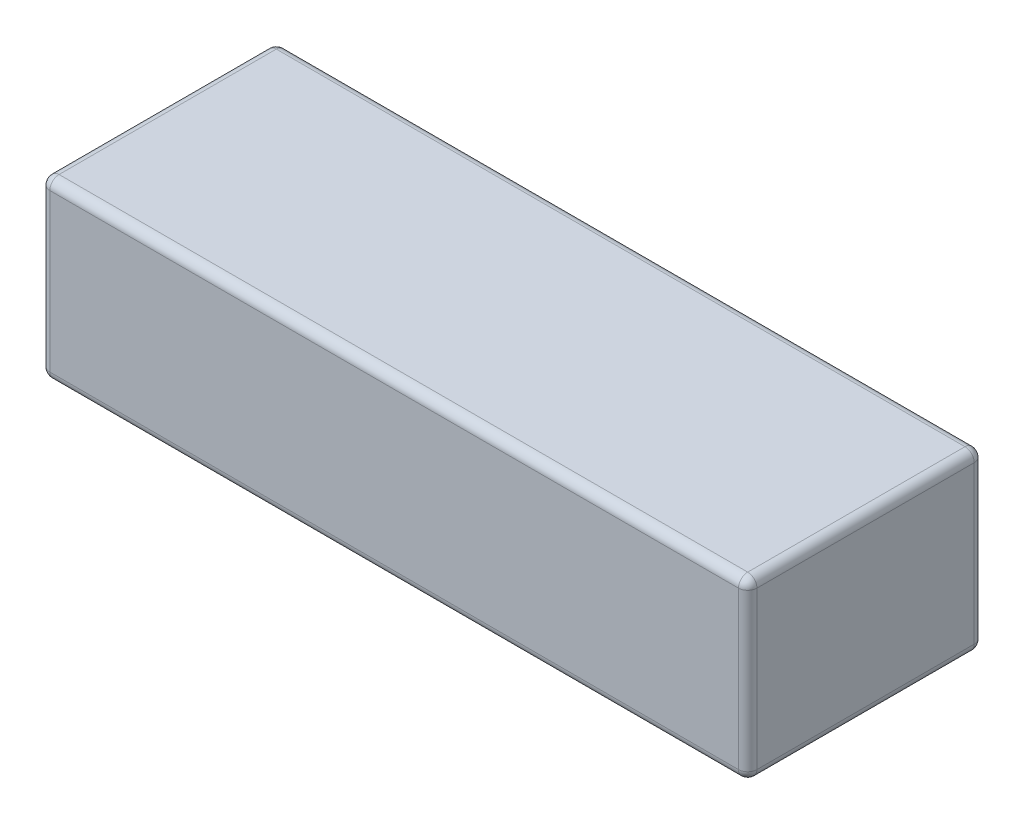
ISO-10303-21;
HEADER;
FILE_DESCRIPTION(('STEP AP214'),'2;1');
FILE_NAME('part.step','',(''),(''),'','','');
FILE_SCHEMA(('AUTOMOTIVE_DESIGN { 1 0 10303 214 1 1 1 1 }'));
ENDSEC;
DATA;
#1=APPLICATION_CONTEXT('core data for automotive mechanical design processes');
#2=APPLICATION_PROTOCOL_DEFINITION('international standard','automotive_design',2000,#1);
#3=PRODUCT_CONTEXT('',#1,'mechanical');
#4=PRODUCT('Part','Part','',(#3));
#5=PRODUCT_RELATED_PRODUCT_CATEGORY('part','',(#4));
#6=PRODUCT_DEFINITION_FORMATION('','',#4);
#7=PRODUCT_DEFINITION_CONTEXT('part definition',#1,'design');
#8=PRODUCT_DEFINITION('design','',#6,#7);
#9=PRODUCT_DEFINITION_SHAPE('','',#8);
#10=(LENGTH_UNIT() NAMED_UNIT(*) SI_UNIT(.MILLI.,.METRE.));
#11=(NAMED_UNIT(*) PLANE_ANGLE_UNIT() SI_UNIT($,.RADIAN.));
#12=(NAMED_UNIT(*) SI_UNIT($,.STERADIAN.) SOLID_ANGLE_UNIT());
#13=UNCERTAINTY_MEASURE_WITH_UNIT(LENGTH_MEASURE(1.E-05),#10,'distance_accuracy_value','');
#14=(GEOMETRIC_REPRESENTATION_CONTEXT(3) GLOBAL_UNCERTAINTY_ASSIGNED_CONTEXT((#13)) GLOBAL_UNIT_ASSIGNED_CONTEXT((#10,
#11,#12)) REPRESENTATION_CONTEXT('',''));
#15=CARTESIAN_POINT('',(0.,0.,0.));
#16=DIRECTION('',(0.,0.,1.));
#17=DIRECTION('',(1.,0.,0.));
#18=AXIS2_PLACEMENT_3D('',#15,#16,#17);
#19=CARTESIAN_POINT('',(0.,0.,51.));
#20=DIRECTION('',(1.,0.,0.));
#21=DIRECTION('',(0.,0.,-1.));
#22=AXIS2_PLACEMENT_3D('',#19,#20,#21);
#23=PLANE('',#22);
#24=DIRECTION('',(0.,0.,-1.));
#25=VECTOR('',#24,1.);
#26=CARTESIAN_POINT('',(0.,36.,51.));
#27=LINE('',#26,#25);
#28=CARTESIAN_POINT('',(0.,36.,49.));
#29=VERTEX_POINT('',#28);
#30=CARTESIAN_POINT('',(0.,36.,2.));
#31=VERTEX_POINT('',#30);
#32=EDGE_CURVE('E129',#29,#31,#27,.T.);
#33=ORIENTED_EDGE('',*,*,#32,.T.);
#34=DIRECTION('',(0.,-1.,0.));
#35=VECTOR('',#34,1.);
#36=CARTESIAN_POINT('',(0.,0.,2.));
#37=LINE('',#36,#35);
#38=CARTESIAN_POINT('',(0.,2.,2.));
#39=VERTEX_POINT('',#38);
#40=EDGE_CURVE('E165',#31,#39,#37,.T.);
#41=ORIENTED_EDGE('',*,*,#40,.T.);
#42=DIRECTION('',(0.,0.,-1.));
#43=VECTOR('',#42,1.);
#44=CARTESIAN_POINT('',(0.,2.,51.));
#45=LINE('',#44,#43);
#46=CARTESIAN_POINT('',(0.,2.,49.));
#47=VERTEX_POINT('',#46);
#48=EDGE_CURVE('E132',#39,#47,#45,.F.);
#49=ORIENTED_EDGE('',*,*,#48,.T.);
#50=DIRECTION('',(0.,-1.,0.));
#51=VECTOR('',#50,1.);
#52=CARTESIAN_POINT('',(0.,0.,49.));
#53=LINE('',#52,#51);
#54=EDGE_CURVE('E125',#47,#29,#53,.F.);
#55=ORIENTED_EDGE('',*,*,#54,.T.);
#56=EDGE_LOOP('',(#33,#41,#49,#55));
#57=FACE_BOUND('',#56,.T.);
#58=ADVANCED_FACE('F38',(#57),#23,.F.);
#59=CARTESIAN_POINT('',(0.,0.,51.));
#60=DIRECTION('',(0.,1.,0.));
#61=DIRECTION('',(0.,0.,1.));
#62=AXIS2_PLACEMENT_3D('',#59,#60,#61);
#63=PLANE('',#62);
#64=DIRECTION('',(1.,0.,0.));
#65=VECTOR('',#64,1.);
#66=CARTESIAN_POINT('',(0.,0.,49.));
#67=LINE('',#66,#65);
#68=CARTESIAN_POINT('',(151.,0.,49.));
#69=VERTEX_POINT('',#68);
#70=CARTESIAN_POINT('',(2.,0.,49.));
#71=VERTEX_POINT('',#70);
#72=EDGE_CURVE('E176',#69,#71,#67,.F.);
#73=ORIENTED_EDGE('',*,*,#72,.T.);
#74=DIRECTION('',(0.,0.,-1.));
#75=VECTOR('',#74,1.);
#76=CARTESIAN_POINT('',(2.,0.,51.));
#77=LINE('',#76,#75);
#78=CARTESIAN_POINT('',(2.,0.,2.));
#79=VERTEX_POINT('',#78);
#80=EDGE_CURVE('E182',#71,#79,#77,.T.);
#81=ORIENTED_EDGE('',*,*,#80,.T.);
#82=DIRECTION('',(1.,0.,0.));
#83=VECTOR('',#82,1.);
#84=CARTESIAN_POINT('',(153.,0.,2.));
#85=LINE('',#84,#83);
#86=CARTESIAN_POINT('',(151.,0.,2.));
#87=VERTEX_POINT('',#86);
#88=EDGE_CURVE('E180',#79,#87,#85,.T.);
#89=ORIENTED_EDGE('',*,*,#88,.T.);
#90=DIRECTION('',(0.,0.,-1.));
#91=VECTOR('',#90,1.);
#92=CARTESIAN_POINT('',(151.,0.,51.));
#93=LINE('',#92,#91);
#94=EDGE_CURVE('E178',#87,#69,#93,.F.);
#95=ORIENTED_EDGE('',*,*,#94,.T.);
#96=EDGE_LOOP('',(#73,#81,#89,#95));
#97=FACE_BOUND('',#96,.T.);
#98=ADVANCED_FACE('F269',(#97),#63,.F.);
#99=CARTESIAN_POINT('',(153.,0.,51.));
#100=DIRECTION('',(-1.,0.,0.));
#101=DIRECTION('',(0.,0.,1.));
#102=AXIS2_PLACEMENT_3D('',#99,#100,#101);
#103=PLANE('',#102);
#104=DIRECTION('',(0.,1.,0.));
#105=VECTOR('',#104,1.);
#106=CARTESIAN_POINT('',(153.,0.,49.));
#107=LINE('',#106,#105);
#108=CARTESIAN_POINT('',(153.,36.,49.));
#109=VERTEX_POINT('',#108);
#110=CARTESIAN_POINT('',(153.,2.,49.));
#111=VERTEX_POINT('',#110);
#112=EDGE_CURVE('E187',#109,#111,#107,.F.);
#113=ORIENTED_EDGE('',*,*,#112,.T.);
#114=DIRECTION('',(0.,0.,-1.));
#115=VECTOR('',#114,1.);
#116=CARTESIAN_POINT('',(153.,2.,51.));
#117=LINE('',#116,#115);
#118=CARTESIAN_POINT('',(153.,2.,2.));
#119=VERTEX_POINT('',#118);
#120=EDGE_CURVE('E191',#111,#119,#117,.T.);
#121=ORIENTED_EDGE('',*,*,#120,.T.);
#122=DIRECTION('',(0.,1.,0.));
#123=VECTOR('',#122,1.);
#124=CARTESIAN_POINT('',(153.,38.,2.));
#125=LINE('',#124,#123);
#126=CARTESIAN_POINT('',(153.,36.,2.));
#127=VERTEX_POINT('',#126);
#128=EDGE_CURVE('E189',#119,#127,#125,.T.);
#129=ORIENTED_EDGE('',*,*,#128,.T.);
#130=DIRECTION('',(0.,0.,-1.));
#131=VECTOR('',#130,1.);
#132=CARTESIAN_POINT('',(153.,36.,51.));
#133=LINE('',#132,#131);
#134=EDGE_CURVE('E185',#127,#109,#133,.F.);
#135=ORIENTED_EDGE('',*,*,#134,.T.);
#136=EDGE_LOOP('',(#113,#121,#129,#135));
#137=FACE_BOUND('',#136,.T.);
#138=ADVANCED_FACE('F278',(#137),#103,.F.);
#139=CARTESIAN_POINT('',(0.,38.,51.));
#140=DIRECTION('',(0.,-1.,0.));
#141=DIRECTION('',(0.,0.,-1.));
#142=AXIS2_PLACEMENT_3D('',#139,#140,#141);
#143=PLANE('',#142);
#144=DIRECTION('',(-1.,0.,0.));
#145=VECTOR('',#144,1.);
#146=CARTESIAN_POINT('',(0.,38.,49.));
#147=LINE('',#146,#145);
#148=CARTESIAN_POINT('',(2.,38.,49.));
#149=VERTEX_POINT('',#148);
#150=CARTESIAN_POINT('',(151.,38.,49.));
#151=VERTEX_POINT('',#150);
#152=EDGE_CURVE('E47',#149,#151,#147,.F.);
#153=ORIENTED_EDGE('',*,*,#152,.T.);
#154=DIRECTION('',(0.,0.,-1.));
#155=VECTOR('',#154,1.);
#156=CARTESIAN_POINT('',(151.,38.,51.));
#157=LINE('',#156,#155);
#158=CARTESIAN_POINT('',(151.,38.,2.));
#159=VERTEX_POINT('',#158);
#160=EDGE_CURVE('E11',#151,#159,#157,.T.);
#161=ORIENTED_EDGE('',*,*,#160,.T.);
#162=DIRECTION('',(-1.,0.,0.));
#163=VECTOR('',#162,1.);
#164=CARTESIAN_POINT('',(0.,38.,2.));
#165=LINE('',#164,#163);
#166=CARTESIAN_POINT('',(2.,38.,2.));
#167=VERTEX_POINT('',#166);
#168=EDGE_CURVE('E202',#159,#167,#165,.T.);
#169=ORIENTED_EDGE('',*,*,#168,.T.);
#170=DIRECTION('',(0.,0.,-1.));
#171=VECTOR('',#170,1.);
#172=CARTESIAN_POINT('',(2.,38.,51.));
#173=LINE('',#172,#171);
#174=EDGE_CURVE('E58',#167,#149,#173,.F.);
#175=ORIENTED_EDGE('',*,*,#174,.T.);
#176=EDGE_LOOP('',(#153,#161,#169,#175));
#177=FACE_BOUND('',#176,.T.);
#178=ADVANCED_FACE('F290',(#177),#143,.F.);
#179=CARTESIAN_POINT('',(0.,0.,51.));
#180=DIRECTION('',(0.,0.,-1.));
#181=DIRECTION('',(-1.,0.,0.));
#182=AXIS2_PLACEMENT_3D('',#179,#180,#181);
#183=PLANE('',#182);
#184=DIRECTION('',(1.,0.,0.));
#185=VECTOR('',#184,1.);
#186=CARTESIAN_POINT('',(0.,2.,51.));
#187=LINE('',#186,#185);
#188=CARTESIAN_POINT('',(2.,2.,51.));
#189=VERTEX_POINT('',#188);
#190=CARTESIAN_POINT('',(151.,2.,51.));
#191=VERTEX_POINT('',#190);
#192=EDGE_CURVE('E197',#189,#191,#187,.T.);
#193=ORIENTED_EDGE('',*,*,#192,.T.);
#194=DIRECTION('',(0.,1.,0.));
#195=VECTOR('',#194,1.);
#196=CARTESIAN_POINT('',(151.,0.,51.));
#197=LINE('',#196,#195);
#198=CARTESIAN_POINT('',(151.,36.,51.));
#199=VERTEX_POINT('',#198);
#200=EDGE_CURVE('E199',#191,#199,#197,.T.);
#201=ORIENTED_EDGE('',*,*,#200,.T.);
#202=DIRECTION('',(-1.,0.,0.));
#203=VECTOR('',#202,1.);
#204=CARTESIAN_POINT('',(0.,36.,51.));
#205=LINE('',#204,#203);
#206=CARTESIAN_POINT('',(2.,36.,51.));
#207=VERTEX_POINT('',#206);
#208=EDGE_CURVE('E194',#199,#207,#205,.T.);
#209=ORIENTED_EDGE('',*,*,#208,.T.);
#210=DIRECTION('',(0.,-1.,0.));
#211=VECTOR('',#210,1.);
#212=CARTESIAN_POINT('',(2.,0.,51.));
#213=LINE('',#212,#211);
#214=EDGE_CURVE('E142',#207,#189,#213,.T.);
#215=ORIENTED_EDGE('',*,*,#214,.T.);
#216=EDGE_LOOP('',(#193,#201,#209,#215));
#217=FACE_BOUND('',#216,.T.);
#218=ADVANCED_FACE('F482',(#217),#183,.F.);
#219=CARTESIAN_POINT('',(0.,0.,0.));
#220=DIRECTION('',(0.,0.,-1.));
#221=DIRECTION('',(-1.,0.,0.));
#222=AXIS2_PLACEMENT_3D('',#219,#220,#221);
#223=PLANE('',#222);
#224=DIRECTION('',(1.,0.,0.));
#225=VECTOR('',#224,1.);
#226=CARTESIAN_POINT('',(0.,2.,0.));
#227=LINE('',#226,#225);
#228=CARTESIAN_POINT('',(151.,2.,0.));
#229=VERTEX_POINT('',#228);
#230=CARTESIAN_POINT('',(2.,2.,0.));
#231=VERTEX_POINT('',#230);
#232=EDGE_CURVE('E171',#229,#231,#227,.F.);
#233=ORIENTED_EDGE('',*,*,#232,.T.);
#234=DIRECTION('',(0.,-1.,0.));
#235=VECTOR('',#234,1.);
#236=CARTESIAN_POINT('',(2.,38.,0.));
#237=LINE('',#236,#235);
#238=CARTESIAN_POINT('',(2.,36.,0.));
#239=VERTEX_POINT('',#238);
#240=EDGE_CURVE('E173',#231,#239,#237,.F.);
#241=ORIENTED_EDGE('',*,*,#240,.T.);
#242=DIRECTION('',(-1.,0.,0.));
#243=VECTOR('',#242,1.);
#244=CARTESIAN_POINT('',(153.,36.,0.));
#245=LINE('',#244,#243);
#246=CARTESIAN_POINT('',(151.,36.,0.));
#247=VERTEX_POINT('',#246);
#248=EDGE_CURVE('E167',#239,#247,#245,.F.);
#249=ORIENTED_EDGE('',*,*,#248,.T.);
#250=DIRECTION('',(0.,1.,0.));
#251=VECTOR('',#250,1.);
#252=CARTESIAN_POINT('',(151.,0.,0.));
#253=LINE('',#252,#251);
#254=EDGE_CURVE('E169',#247,#229,#253,.F.);
#255=ORIENTED_EDGE('',*,*,#254,.T.);
#256=EDGE_LOOP('',(#233,#241,#249,#255));
#257=FACE_BOUND('',#256,.T.);
#258=ADVANCED_FACE('F475',(#257),#223,.T.);
#259=CARTESIAN_POINT('',(151.,0.,49.));
#260=DIRECTION('',(0.,1.,0.));
#261=DIRECTION('',(0.,0.,1.));
#262=AXIS2_PLACEMENT_3D('',#259,#260,#261);
#263=CYLINDRICAL_SURFACE('',#262,2.);
#264=CARTESIAN_POINT('',(151.,36.,49.));
#265=DIRECTION('',(0.,1.,0.));
#266=DIRECTION('',(0.,0.,1.));
#267=AXIS2_PLACEMENT_3D('',#264,#265,#266);
#268=CIRCLE('',#267,2.);
#269=EDGE_CURVE('E42',#199,#109,#268,.T.);
#270=ORIENTED_EDGE('',*,*,#269,.F.);
#271=ORIENTED_EDGE('',*,*,#200,.F.);
#272=CARTESIAN_POINT('',(151.,2.,49.));
#273=DIRECTION('',(0.,-1.,0.));
#274=DIRECTION('',(0.,0.,-1.));
#275=AXIS2_PLACEMENT_3D('',#272,#273,#274);
#276=CIRCLE('',#275,2.);
#277=EDGE_CURVE('E162',#111,#191,#276,.T.);
#278=ORIENTED_EDGE('',*,*,#277,.F.);
#279=ORIENTED_EDGE('',*,*,#112,.F.);
#280=EDGE_LOOP('',(#270,#271,#278,#279));
#281=FACE_BOUND('',#280,.T.);
#282=ADVANCED_FACE('F40',(#281),#263,.T.);
#283=CARTESIAN_POINT('',(151.,36.,49.));
#284=DIRECTION('',(0.,0.,1.));
#285=DIRECTION('',(1.,0.,0.));
#286=AXIS2_PLACEMENT_3D('',#283,#284,#285);
#287=SPHERICAL_SURFACE('',#286,2.);
#288=CARTESIAN_POINT('',(151.,36.,49.));
#289=DIRECTION('',(1.,0.,0.));
#290=DIRECTION('',(0.,0.,-1.));
#291=AXIS2_PLACEMENT_3D('',#288,#289,#290);
#292=CIRCLE('',#291,2.);
#293=EDGE_CURVE('E248',#199,#151,#292,.F.);
#294=ORIENTED_EDGE('',*,*,#293,.F.);
#295=ORIENTED_EDGE('',*,*,#269,.T.);
#296=CARTESIAN_POINT('',(151.,36.,49.));
#297=DIRECTION('',(0.,0.,1.));
#298=DIRECTION('',(1.,0.,0.));
#299=AXIS2_PLACEMENT_3D('',#296,#297,#298);
#300=CIRCLE('',#299,2.);
#301=EDGE_CURVE('E250',#151,#109,#300,.F.);
#302=ORIENTED_EDGE('',*,*,#301,.F.);
#303=EDGE_LOOP('',(#294,#295,#302));
#304=FACE_BOUND('',#303,.T.);
#305=ADVANCED_FACE('F284',(#304),#287,.T.);
#306=CARTESIAN_POINT('',(151.,2.,49.));
#307=DIRECTION('',(0.,0.,1.));
#308=DIRECTION('',(1.,0.,0.));
#309=AXIS2_PLACEMENT_3D('',#306,#307,#308);
#310=SPHERICAL_SURFACE('',#309,2.);
#311=CARTESIAN_POINT('',(151.,2.,49.));
#312=DIRECTION('',(0.,0.,1.));
#313=DIRECTION('',(1.,0.,0.));
#314=AXIS2_PLACEMENT_3D('',#311,#312,#313);
#315=CIRCLE('',#314,2.);
#316=EDGE_CURVE('E242',#111,#69,#315,.F.);
#317=ORIENTED_EDGE('',*,*,#316,.F.);
#318=ORIENTED_EDGE('',*,*,#277,.T.);
#319=CARTESIAN_POINT('',(151.,2.,49.));
#320=DIRECTION('',(1.,0.,0.));
#321=DIRECTION('',(0.,0.,-1.));
#322=AXIS2_PLACEMENT_3D('',#319,#320,#321);
#323=CIRCLE('',#322,2.);
#324=EDGE_CURVE('E245',#69,#191,#323,.F.);
#325=ORIENTED_EDGE('',*,*,#324,.F.);
#326=EDGE_LOOP('',(#317,#318,#325));
#327=FACE_BOUND('',#326,.T.);
#328=ADVANCED_FACE('F257',(#327),#310,.T.);
#329=CARTESIAN_POINT('',(151.,36.,51.));
#330=DIRECTION('',(0.,0.,-1.));
#331=DIRECTION('',(-1.,0.,0.));
#332=AXIS2_PLACEMENT_3D('',#329,#330,#331);
#333=CYLINDRICAL_SURFACE('',#332,2.);
#334=ORIENTED_EDGE('',*,*,#301,.T.);
#335=ORIENTED_EDGE('',*,*,#134,.F.);
#336=CARTESIAN_POINT('',(151.,36.,2.));
#337=DIRECTION('',(0.,0.,-1.));
#338=DIRECTION('',(-1.,0.,0.));
#339=AXIS2_PLACEMENT_3D('',#336,#337,#338);
#340=CIRCLE('',#339,2.);
#341=EDGE_CURVE('E236',#159,#127,#340,.T.);
#342=ORIENTED_EDGE('',*,*,#341,.F.);
#343=ORIENTED_EDGE('',*,*,#160,.F.);
#344=EDGE_LOOP('',(#334,#335,#342,#343));
#345=FACE_BOUND('',#344,.T.);
#346=ADVANCED_FACE('F287',(#345),#333,.T.);
#347=CARTESIAN_POINT('',(0.,36.,49.));
#348=DIRECTION('',(-1.,0.,0.));
#349=DIRECTION('',(0.,0.,1.));
#350=AXIS2_PLACEMENT_3D('',#347,#348,#349);
#351=CYLINDRICAL_SURFACE('',#350,2.);
#352=ORIENTED_EDGE('',*,*,#293,.T.);
#353=ORIENTED_EDGE('',*,*,#152,.F.);
#354=CARTESIAN_POINT('',(2.,36.,49.));
#355=DIRECTION('',(-1.,0.,0.));
#356=DIRECTION('',(0.,0.,1.));
#357=AXIS2_PLACEMENT_3D('',#354,#355,#356);
#358=CIRCLE('',#357,2.);
#359=EDGE_CURVE('E146',#207,#149,#358,.T.);
#360=ORIENTED_EDGE('',*,*,#359,.F.);
#361=ORIENTED_EDGE('',*,*,#208,.F.);
#362=EDGE_LOOP('',(#352,#353,#360,#361));
#363=FACE_BOUND('',#362,.T.);
#364=ADVANCED_FACE('F439',(#363),#351,.T.);
#365=CARTESIAN_POINT('',(2.,0.,49.));
#366=DIRECTION('',(0.,-1.,0.));
#367=DIRECTION('',(0.,0.,-1.));
#368=AXIS2_PLACEMENT_3D('',#365,#366,#367);
#369=CYLINDRICAL_SURFACE('',#368,2.);
#370=CARTESIAN_POINT('',(2.,2.,49.));
#371=DIRECTION('',(0.,-1.,0.));
#372=DIRECTION('',(0.,0.,-1.));
#373=AXIS2_PLACEMENT_3D('',#370,#371,#372);
#374=CIRCLE('',#373,2.);
#375=EDGE_CURVE('E147',#189,#47,#374,.T.);
#376=ORIENTED_EDGE('',*,*,#375,.F.);
#377=ORIENTED_EDGE('',*,*,#214,.F.);
#378=CARTESIAN_POINT('',(2.,36.,49.));
#379=DIRECTION('',(0.,1.,0.));
#380=DIRECTION('',(0.,0.,1.));
#381=AXIS2_PLACEMENT_3D('',#378,#379,#380);
#382=CIRCLE('',#381,2.);
#383=EDGE_CURVE('E139',#29,#207,#382,.T.);
#384=ORIENTED_EDGE('',*,*,#383,.F.);
#385=ORIENTED_EDGE('',*,*,#54,.F.);
#386=EDGE_LOOP('',(#376,#377,#384,#385));
#387=FACE_BOUND('',#386,.T.);
#388=ADVANCED_FACE('F141',(#387),#369,.T.);
#389=CARTESIAN_POINT('',(0.,2.,49.));
#390=DIRECTION('',(1.,0.,0.));
#391=DIRECTION('',(0.,0.,-1.));
#392=AXIS2_PLACEMENT_3D('',#389,#390,#391);
#393=CYLINDRICAL_SURFACE('',#392,2.);
#394=ORIENTED_EDGE('',*,*,#324,.T.);
#395=ORIENTED_EDGE('',*,*,#192,.F.);
#396=CARTESIAN_POINT('',(2.,2.,49.));
#397=DIRECTION('',(-1.,0.,0.));
#398=DIRECTION('',(0.,0.,1.));
#399=AXIS2_PLACEMENT_3D('',#396,#397,#398);
#400=CIRCLE('',#399,2.);
#401=EDGE_CURVE('E231',#71,#189,#400,.T.);
#402=ORIENTED_EDGE('',*,*,#401,.F.);
#403=ORIENTED_EDGE('',*,*,#72,.F.);
#404=EDGE_LOOP('',(#394,#395,#402,#403));
#405=FACE_BOUND('',#404,.T.);
#406=ADVANCED_FACE('F265',(#405),#393,.T.);
#407=CARTESIAN_POINT('',(151.,2.,51.));
#408=DIRECTION('',(0.,0.,-1.));
#409=DIRECTION('',(-1.,0.,0.));
#410=AXIS2_PLACEMENT_3D('',#407,#408,#409);
#411=CYLINDRICAL_SURFACE('',#410,2.);
#412=ORIENTED_EDGE('',*,*,#316,.T.);
#413=ORIENTED_EDGE('',*,*,#94,.F.);
#414=CARTESIAN_POINT('',(151.,2.,2.));
#415=DIRECTION('',(0.,0.,-1.));
#416=DIRECTION('',(-1.,0.,0.));
#417=AXIS2_PLACEMENT_3D('',#414,#415,#416);
#418=CIRCLE('',#417,2.);
#419=EDGE_CURVE('E228',#119,#87,#418,.T.);
#420=ORIENTED_EDGE('',*,*,#419,.F.);
#421=ORIENTED_EDGE('',*,*,#120,.F.);
#422=EDGE_LOOP('',(#412,#413,#420,#421));
#423=FACE_BOUND('',#422,.T.);
#424=ADVANCED_FACE('F275',(#423),#411,.T.);
#425=CARTESIAN_POINT('',(151.,0.,2.));
#426=DIRECTION('',(0.,-1.,0.));
#427=DIRECTION('',(0.,0.,-1.));
#428=AXIS2_PLACEMENT_3D('',#425,#426,#427);
#429=CYLINDRICAL_SURFACE('',#428,2.);
#430=CARTESIAN_POINT('',(151.,36.,2.));
#431=DIRECTION('',(0.,1.,0.));
#432=DIRECTION('',(0.,0.,1.));
#433=AXIS2_PLACEMENT_3D('',#430,#431,#432);
#434=CIRCLE('',#433,2.);
#435=EDGE_CURVE('E239',#127,#247,#434,.T.);
#436=ORIENTED_EDGE('',*,*,#435,.F.);
#437=ORIENTED_EDGE('',*,*,#128,.F.);
#438=CARTESIAN_POINT('',(151.,2.,2.));
#439=DIRECTION('',(0.,-1.,0.));
#440=DIRECTION('',(0.,0.,-1.));
#441=AXIS2_PLACEMENT_3D('',#438,#439,#440);
#442=CIRCLE('',#441,2.);
#443=EDGE_CURVE('E226',#229,#119,#442,.T.);
#444=ORIENTED_EDGE('',*,*,#443,.F.);
#445=ORIENTED_EDGE('',*,*,#254,.F.);
#446=EDGE_LOOP('',(#436,#437,#444,#445));
#447=FACE_BOUND('',#446,.T.);
#448=ADVANCED_FACE('F408',(#447),#429,.T.);
#449=CARTESIAN_POINT('',(151.,36.,2.));
#450=DIRECTION('',(0.,0.,1.));
#451=DIRECTION('',(1.,0.,0.));
#452=AXIS2_PLACEMENT_3D('',#449,#450,#451);
#453=SPHERICAL_SURFACE('',#452,2.);
#454=ORIENTED_EDGE('',*,*,#341,.T.);
#455=ORIENTED_EDGE('',*,*,#435,.T.);
#456=CARTESIAN_POINT('',(151.,36.,2.));
#457=DIRECTION('',(1.,0.,0.));
#458=DIRECTION('',(0.,0.,-1.));
#459=AXIS2_PLACEMENT_3D('',#456,#457,#458);
#460=CIRCLE('',#459,2.);
#461=EDGE_CURVE('E153',#159,#247,#460,.F.);
#462=ORIENTED_EDGE('',*,*,#461,.F.);
#463=EDGE_LOOP('',(#454,#455,#462));
#464=FACE_BOUND('',#463,.T.);
#465=ADVANCED_FACE('F320',(#464),#453,.T.);
#466=CARTESIAN_POINT('',(2.,36.,49.));
#467=DIRECTION('',(0.,0.,1.));
#468=DIRECTION('',(1.,0.,0.));
#469=AXIS2_PLACEMENT_3D('',#466,#467,#468);
#470=SPHERICAL_SURFACE('',#469,2.);
#471=ORIENTED_EDGE('',*,*,#383,.T.);
#472=ORIENTED_EDGE('',*,*,#359,.T.);
#473=CARTESIAN_POINT('',(2.,36.,49.));
#474=DIRECTION('',(0.,0.,1.));
#475=DIRECTION('',(1.,0.,0.));
#476=AXIS2_PLACEMENT_3D('',#473,#474,#475);
#477=CIRCLE('',#476,2.);
#478=EDGE_CURVE('E150',#29,#149,#477,.F.);
#479=ORIENTED_EDGE('',*,*,#478,.F.);
#480=EDGE_LOOP('',(#471,#472,#479));
#481=FACE_BOUND('',#480,.T.);
#482=ADVANCED_FACE('F151',(#481),#470,.T.);
#483=CARTESIAN_POINT('',(2.,2.,49.));
#484=DIRECTION('',(0.,0.,1.));
#485=DIRECTION('',(1.,0.,0.));
#486=AXIS2_PLACEMENT_3D('',#483,#484,#485);
#487=SPHERICAL_SURFACE('',#486,2.);
#488=ORIENTED_EDGE('',*,*,#401,.T.);
#489=ORIENTED_EDGE('',*,*,#375,.T.);
#490=CARTESIAN_POINT('',(2.,2.,49.));
#491=DIRECTION('',(0.,0.,1.));
#492=DIRECTION('',(1.,0.,0.));
#493=AXIS2_PLACEMENT_3D('',#490,#491,#492);
#494=CIRCLE('',#493,2.);
#495=EDGE_CURVE('E154',#71,#47,#494,.F.);
#496=ORIENTED_EDGE('',*,*,#495,.F.);
#497=EDGE_LOOP('',(#488,#489,#496));
#498=FACE_BOUND('',#497,.T.);
#499=ADVANCED_FACE('F310',(#498),#487,.T.);
#500=CARTESIAN_POINT('',(151.,2.,2.));
#501=DIRECTION('',(0.,0.,1.));
#502=DIRECTION('',(1.,0.,0.));
#503=AXIS2_PLACEMENT_3D('',#500,#501,#502);
#504=SPHERICAL_SURFACE('',#503,2.);
#505=ORIENTED_EDGE('',*,*,#443,.T.);
#506=ORIENTED_EDGE('',*,*,#419,.T.);
#507=CARTESIAN_POINT('',(151.,2.,2.));
#508=DIRECTION('',(1.,0.,0.));
#509=DIRECTION('',(0.,0.,-1.));
#510=AXIS2_PLACEMENT_3D('',#507,#508,#509);
#511=CIRCLE('',#510,2.);
#512=EDGE_CURVE('E219',#229,#87,#511,.F.);
#513=ORIENTED_EDGE('',*,*,#512,.F.);
#514=EDGE_LOOP('',(#505,#506,#513));
#515=FACE_BOUND('',#514,.T.);
#516=ADVANCED_FACE('F312',(#515),#504,.T.);
#517=CARTESIAN_POINT('',(0.,36.,2.));
#518=DIRECTION('',(1.,0.,0.));
#519=DIRECTION('',(0.,0.,-1.));
#520=AXIS2_PLACEMENT_3D('',#517,#518,#519);
#521=CYLINDRICAL_SURFACE('',#520,2.);
#522=ORIENTED_EDGE('',*,*,#461,.T.);
#523=ORIENTED_EDGE('',*,*,#248,.F.);
#524=CARTESIAN_POINT('',(2.,36.,2.));
#525=DIRECTION('',(-1.,0.,0.));
#526=DIRECTION('',(0.,0.,1.));
#527=AXIS2_PLACEMENT_3D('',#524,#525,#526);
#528=CIRCLE('',#527,2.);
#529=EDGE_CURVE('E216',#167,#239,#528,.T.);
#530=ORIENTED_EDGE('',*,*,#529,.F.);
#531=ORIENTED_EDGE('',*,*,#168,.F.);
#532=EDGE_LOOP('',(#522,#523,#530,#531));
#533=FACE_BOUND('',#532,.T.);
#534=ADVANCED_FACE('F295',(#533),#521,.T.);
#535=CARTESIAN_POINT('',(2.,36.,51.));
#536=DIRECTION('',(0.,0.,-1.));
#537=DIRECTION('',(-1.,0.,0.));
#538=AXIS2_PLACEMENT_3D('',#535,#536,#537);
#539=CYLINDRICAL_SURFACE('',#538,2.);
#540=ORIENTED_EDGE('',*,*,#478,.T.);
#541=ORIENTED_EDGE('',*,*,#174,.F.);
#542=CARTESIAN_POINT('',(2.,36.,2.));
#543=DIRECTION('',(0.,0.,-1.));
#544=DIRECTION('',(-1.,0.,0.));
#545=AXIS2_PLACEMENT_3D('',#542,#543,#544);
#546=CIRCLE('',#545,2.);
#547=EDGE_CURVE('E158',#31,#167,#546,.T.);
#548=ORIENTED_EDGE('',*,*,#547,.F.);
#549=ORIENTED_EDGE('',*,*,#32,.F.);
#550=EDGE_LOOP('',(#540,#541,#548,#549));
#551=FACE_BOUND('',#550,.T.);
#552=ADVANCED_FACE('F156',(#551),#539,.T.);
#553=CARTESIAN_POINT('',(2.,2.,51.));
#554=DIRECTION('',(0.,0.,-1.));
#555=DIRECTION('',(-1.,0.,0.));
#556=AXIS2_PLACEMENT_3D('',#553,#554,#555);
#557=CYLINDRICAL_SURFACE('',#556,2.);
#558=ORIENTED_EDGE('',*,*,#495,.T.);
#559=ORIENTED_EDGE('',*,*,#48,.F.);
#560=CARTESIAN_POINT('',(2.,2.,2.));
#561=DIRECTION('',(0.,0.,-1.));
#562=DIRECTION('',(-1.,0.,0.));
#563=AXIS2_PLACEMENT_3D('',#560,#561,#562);
#564=CIRCLE('',#563,2.);
#565=EDGE_CURVE('E212',#79,#39,#564,.T.);
#566=ORIENTED_EDGE('',*,*,#565,.F.);
#567=ORIENTED_EDGE('',*,*,#80,.F.);
#568=EDGE_LOOP('',(#558,#559,#566,#567));
#569=FACE_BOUND('',#568,.T.);
#570=ADVANCED_FACE('F308',(#569),#557,.T.);
#571=CARTESIAN_POINT('',(0.,2.,2.));
#572=DIRECTION('',(-1.,0.,0.));
#573=DIRECTION('',(0.,0.,1.));
#574=AXIS2_PLACEMENT_3D('',#571,#572,#573);
#575=CYLINDRICAL_SURFACE('',#574,2.);
#576=ORIENTED_EDGE('',*,*,#512,.T.);
#577=ORIENTED_EDGE('',*,*,#88,.F.);
#578=CARTESIAN_POINT('',(2.,2.,2.));
#579=DIRECTION('',(-1.,0.,0.));
#580=DIRECTION('',(0.,0.,1.));
#581=AXIS2_PLACEMENT_3D('',#578,#579,#580);
#582=CIRCLE('',#581,2.);
#583=EDGE_CURVE('E210',#231,#79,#582,.T.);
#584=ORIENTED_EDGE('',*,*,#583,.F.);
#585=ORIENTED_EDGE('',*,*,#232,.F.);
#586=EDGE_LOOP('',(#576,#577,#584,#585));
#587=FACE_BOUND('',#586,.T.);
#588=ADVANCED_FACE('F336',(#587),#575,.T.);
#589=CARTESIAN_POINT('',(2.,36.,2.));
#590=DIRECTION('',(0.,0.,1.));
#591=DIRECTION('',(1.,0.,0.));
#592=AXIS2_PLACEMENT_3D('',#589,#590,#591);
#593=SPHERICAL_SURFACE('',#592,2.);
#594=ORIENTED_EDGE('',*,*,#547,.T.);
#595=ORIENTED_EDGE('',*,*,#529,.T.);
#596=CARTESIAN_POINT('',(2.,36.,2.));
#597=DIRECTION('',(0.,1.,0.));
#598=DIRECTION('',(0.,0.,1.));
#599=AXIS2_PLACEMENT_3D('',#596,#597,#598);
#600=CIRCLE('',#599,2.);
#601=EDGE_CURVE('E208',#31,#239,#600,.F.);
#602=ORIENTED_EDGE('',*,*,#601,.F.);
#603=EDGE_LOOP('',(#594,#595,#602));
#604=FACE_BOUND('',#603,.T.);
#605=ADVANCED_FACE('F297',(#604),#593,.T.);
#606=CARTESIAN_POINT('',(2.,2.,2.));
#607=DIRECTION('',(0.,0.,1.));
#608=DIRECTION('',(1.,0.,0.));
#609=AXIS2_PLACEMENT_3D('',#606,#607,#608);
#610=SPHERICAL_SURFACE('',#609,2.);
#611=ORIENTED_EDGE('',*,*,#583,.T.);
#612=ORIENTED_EDGE('',*,*,#565,.T.);
#613=CARTESIAN_POINT('',(2.,2.,2.));
#614=DIRECTION('',(0.,-1.,0.));
#615=DIRECTION('',(0.,0.,-1.));
#616=AXIS2_PLACEMENT_3D('',#613,#614,#615);
#617=CIRCLE('',#616,2.);
#618=EDGE_CURVE('E206',#231,#39,#617,.F.);
#619=ORIENTED_EDGE('',*,*,#618,.F.);
#620=EDGE_LOOP('',(#611,#612,#619));
#621=FACE_BOUND('',#620,.T.);
#622=ADVANCED_FACE('F305',(#621),#610,.T.);
#623=CARTESIAN_POINT('',(2.,0.,2.));
#624=DIRECTION('',(0.,1.,0.));
#625=DIRECTION('',(0.,0.,1.));
#626=AXIS2_PLACEMENT_3D('',#623,#624,#625);
#627=CYLINDRICAL_SURFACE('',#626,2.);
#628=ORIENTED_EDGE('',*,*,#601,.T.);
#629=ORIENTED_EDGE('',*,*,#240,.F.);
#630=ORIENTED_EDGE('',*,*,#618,.T.);
#631=ORIENTED_EDGE('',*,*,#40,.F.);
#632=EDGE_LOOP('',(#628,#629,#630,#631));
#633=FACE_BOUND('',#632,.T.);
#634=ADVANCED_FACE('F301',(#633),#627,.T.);
#635=CLOSED_SHELL('',(#58,#98,#138,#178,#218,#258,#282,#305,#328,#346,#364,#388,#406,#424,#448,
#465,#482,#499,#516,#534,#552,#570,#588,#605,#622,#634));
#636=MANIFOLD_SOLID_BREP('B2',#635);
#637=ADVANCED_BREP_SHAPE_REPRESENTATION('',(#18,#636),#14);
#638=SHAPE_DEFINITION_REPRESENTATION(#9,#637);
ENDSEC;
END-ISO-10303-21;
